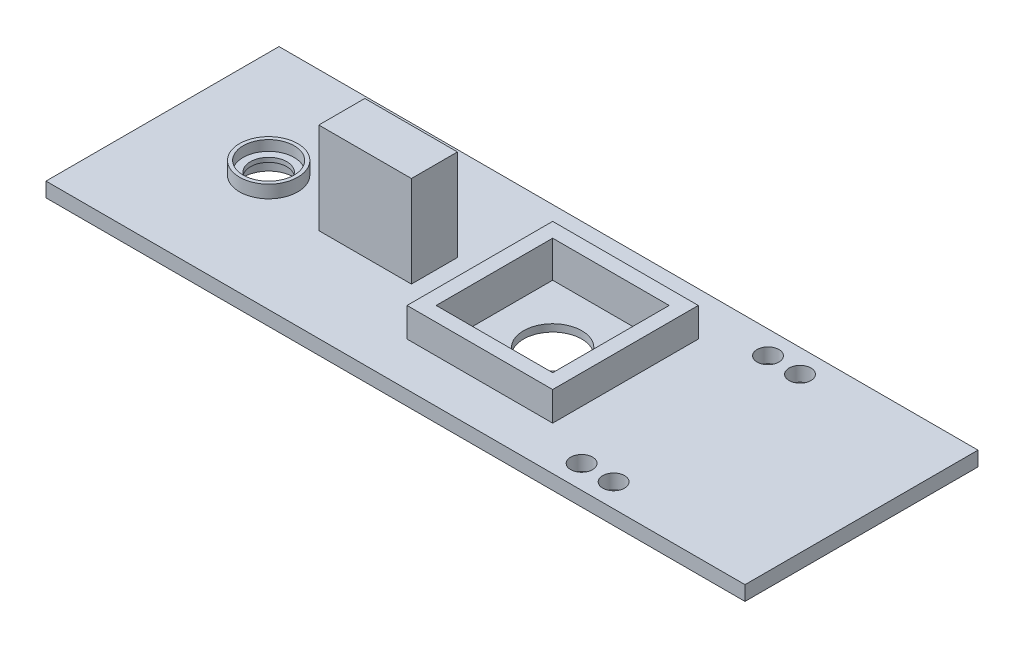
ISO-10303-21;
HEADER;
FILE_DESCRIPTION(('STEP AP214'),'2;1');
FILE_NAME('part.step','',(''),(''),'','','');
FILE_SCHEMA(('AUTOMOTIVE_DESIGN { 1 0 10303 214 1 1 1 1 }'));
ENDSEC;
DATA;
#1=APPLICATION_CONTEXT('core data for automotive mechanical design processes');
#2=APPLICATION_PROTOCOL_DEFINITION('international standard','automotive_design',2000,#1);
#3=PRODUCT_CONTEXT('',#1,'mechanical');
#4=PRODUCT('Part','Part','',(#3));
#5=PRODUCT_RELATED_PRODUCT_CATEGORY('part','',(#4));
#6=PRODUCT_DEFINITION_FORMATION('','',#4);
#7=PRODUCT_DEFINITION_CONTEXT('part definition',#1,'design');
#8=PRODUCT_DEFINITION('design','',#6,#7);
#9=PRODUCT_DEFINITION_SHAPE('','',#8);
#10=(LENGTH_UNIT() NAMED_UNIT(*) SI_UNIT(.MILLI.,.METRE.));
#11=(NAMED_UNIT(*) PLANE_ANGLE_UNIT() SI_UNIT($,.RADIAN.));
#12=(NAMED_UNIT(*) SI_UNIT($,.STERADIAN.) SOLID_ANGLE_UNIT());
#13=UNCERTAINTY_MEASURE_WITH_UNIT(LENGTH_MEASURE(1.E-05),#10,'distance_accuracy_value','');
#14=(GEOMETRIC_REPRESENTATION_CONTEXT(3) GLOBAL_UNCERTAINTY_ASSIGNED_CONTEXT((#13)) GLOBAL_UNIT_ASSIGNED_CONTEXT((#10,
#11,#12)) REPRESENTATION_CONTEXT('',''));
#15=CARTESIAN_POINT('',(0.,0.,0.));
#16=DIRECTION('',(0.,0.,1.));
#17=DIRECTION('',(1.,0.,0.));
#18=AXIS2_PLACEMENT_3D('',#15,#16,#17);
#19=CARTESIAN_POINT('',(-134.66620377136,0.,0.));
#20=DIRECTION('',(0.,1.,0.));
#21=DIRECTION('',(0.,0.,1.));
#22=AXIS2_PLACEMENT_3D('',#19,#20,#21);
#23=CYLINDRICAL_SURFACE('',#22,12.7);
#24=CARTESIAN_POINT('',(-134.66620377136,0.,0.));
#25=DIRECTION('',(0.,1.,0.));
#26=DIRECTION('',(0.,0.,1.));
#27=AXIS2_PLACEMENT_3D('',#24,#25,#26);
#28=CIRCLE('',#27,12.7);
#29=CARTESIAN_POINT('',(-134.66620377136,0.,12.7));
#30=VERTEX_POINT('',#29);
#31=EDGE_CURVE('E260',#30,#30,#28,.T.);
#32=ORIENTED_EDGE('',*,*,#31,.F.);
#33=EDGE_LOOP('',(#32));
#34=FACE_BOUND('',#33,.T.);
#35=CARTESIAN_POINT('',(-134.66620377136,3.175,0.));
#36=DIRECTION('',(0.,1.,0.));
#37=DIRECTION('',(0.,0.,1.));
#38=AXIS2_PLACEMENT_3D('',#35,#36,#37);
#39=CIRCLE('',#38,12.7);
#40=CARTESIAN_POINT('',(-134.66620377136,3.175,12.7));
#41=VERTEX_POINT('',#40);
#42=EDGE_CURVE('E43',#41,#41,#39,.F.);
#43=ORIENTED_EDGE('',*,*,#42,.F.);
#44=EDGE_LOOP('',(#43));
#45=FACE_BOUND('',#44,.T.);
#46=ADVANCED_FACE('F39',(#34,#45),#23,.F.);
#47=CARTESIAN_POINT('',(0.,6.35,0.));
#48=DIRECTION('',(0.,-1.,0.));
#49=DIRECTION('',(0.,0.,-1.));
#50=AXIS2_PLACEMENT_3D('',#47,#48,#49);
#51=PLANE('',#50);
#52=CARTESIAN_POINT('',(-81.4119589800342,6.35,40.64));
#53=DIRECTION('',(0.,1.,0.));
#54=DIRECTION('',(0.,0.,1.));
#55=AXIS2_PLACEMENT_3D('',#52,#53,#54);
#56=CIRCLE('',#55,4.7625);
#57=CARTESIAN_POINT('',(-81.4119589800342,6.35,45.4025));
#58=VERTEX_POINT('',#57);
#59=EDGE_CURVE('E680',#58,#58,#56,.T.);
#60=ORIENTED_EDGE('',*,*,#59,.F.);
#61=EDGE_LOOP('',(#60));
#62=FACE_BOUND('',#61,.T.);
#63=CARTESIAN_POINT('',(-67.4419589800342,6.35,-40.64));
#64=DIRECTION('',(0.,1.,0.));
#65=DIRECTION('',(0.,0.,1.));
#66=AXIS2_PLACEMENT_3D('',#63,#64,#65);
#67=CIRCLE('',#66,4.7625);
#68=CARTESIAN_POINT('',(-67.4419589800342,6.35,-35.8775));
#69=VERTEX_POINT('',#68);
#70=EDGE_CURVE('E685',#69,#69,#67,.T.);
#71=ORIENTED_EDGE('',*,*,#70,.F.);
#72=EDGE_LOOP('',(#71));
#73=FACE_BOUND('',#72,.T.);
#74=CARTESIAN_POINT('',(-81.4119589800342,6.35,-40.64));
#75=DIRECTION('',(0.,1.,0.));
#76=DIRECTION('',(0.,0.,1.));
#77=AXIS2_PLACEMENT_3D('',#74,#75,#76);
#78=CIRCLE('',#77,4.7625);
#79=CARTESIAN_POINT('',(-81.4119589800342,6.35,-35.8775));
#80=VERTEX_POINT('',#79);
#81=EDGE_CURVE('E702',#80,#80,#78,.T.);
#82=ORIENTED_EDGE('',*,*,#81,.F.);
#83=EDGE_LOOP('',(#82));
#84=FACE_BOUND('',#83,.T.);
#85=CARTESIAN_POINT('',(-67.4419589800342,6.35,40.64));
#86=DIRECTION('',(0.,1.,0.));
#87=DIRECTION('',(0.,0.,1.));
#88=AXIS2_PLACEMENT_3D('',#85,#86,#87);
#89=CIRCLE('',#88,4.7625);
#90=CARTESIAN_POINT('',(-67.4419589800342,6.35,45.4025));
#91=VERTEX_POINT('',#90);
#92=EDGE_CURVE('E181',#91,#91,#89,.T.);
#93=ORIENTED_EDGE('',*,*,#92,.F.);
#94=EDGE_LOOP('',(#93));
#95=FACE_BOUND('',#94,.T.);
#96=DIRECTION('',(0.,0.,-1.));
#97=VECTOR('',#96,1.);
#98=CARTESIAN_POINT('',(-226.61201316896,6.35,10.033));
#99=LINE('',#98,#97);
#100=CARTESIAN_POINT('',(-226.61201316896,6.35,10.033));
#101=VERTEX_POINT('',#100);
#102=CARTESIAN_POINT('',(-226.61201316896,6.35,-10.033));
#103=VERTEX_POINT('',#102);
#104=EDGE_CURVE('E56',#101,#103,#99,.T.);
#105=ORIENTED_EDGE('',*,*,#104,.T.);
#106=DIRECTION('',(1.,0.,0.));
#107=VECTOR('',#106,1.);
#108=CARTESIAN_POINT('',(-226.61201316896,6.35,-10.033));
#109=LINE('',#108,#107);
#110=CARTESIAN_POINT('',(-186.22601316896,6.35,-10.033));
#111=VERTEX_POINT('',#110);
#112=EDGE_CURVE('E186',#103,#111,#109,.T.);
#113=ORIENTED_EDGE('',*,*,#112,.T.);
#114=DIRECTION('',(0.,0.,-1.));
#115=VECTOR('',#114,1.);
#116=CARTESIAN_POINT('',(-186.22601316896,6.35,10.033));
#117=LINE('',#116,#115);
#118=CARTESIAN_POINT('',(-186.22601316896,6.35,10.033));
#119=VERTEX_POINT('',#118);
#120=EDGE_CURVE('E170',#119,#111,#117,.T.);
#121=ORIENTED_EDGE('',*,*,#120,.F.);
#122=DIRECTION('',(1.,0.,0.));
#123=VECTOR('',#122,1.);
#124=CARTESIAN_POINT('',(-226.61201316896,6.35,10.033));
#125=LINE('',#124,#123);
#126=EDGE_CURVE('E61',#101,#119,#125,.T.);
#127=ORIENTED_EDGE('',*,*,#126,.F.);
#128=EDGE_LOOP('',(#105,#113,#121,#127));
#129=FACE_BOUND('',#128,.T.);
#130=DIRECTION('',(0.,0.,-1.));
#131=VECTOR('',#130,1.);
#132=CARTESIAN_POINT('',(0.,6.35,50.8));
#133=LINE('',#132,#131);
#134=CARTESIAN_POINT('',(0.,6.35,50.8));
#135=VERTEX_POINT('',#134);
#136=CARTESIAN_POINT('',(0.,6.35,-50.8));
#137=VERTEX_POINT('',#136);
#138=EDGE_CURVE('E283',#135,#137,#133,.T.);
#139=ORIENTED_EDGE('',*,*,#138,.T.);
#140=DIRECTION('',(-1.,0.,0.));
#141=VECTOR('',#140,1.);
#142=CARTESIAN_POINT('',(-304.8,6.35,-50.8));
#143=LINE('',#142,#141);
#144=CARTESIAN_POINT('',(-304.8,6.35,-50.8));
#145=VERTEX_POINT('',#144);
#146=EDGE_CURVE('E286',#137,#145,#143,.T.);
#147=ORIENTED_EDGE('',*,*,#146,.T.);
#148=DIRECTION('',(0.,0.,1.));
#149=VECTOR('',#148,1.);
#150=CARTESIAN_POINT('',(-304.8,6.35,50.8));
#151=LINE('',#150,#149);
#152=CARTESIAN_POINT('',(-304.8,6.35,50.8));
#153=VERTEX_POINT('',#152);
#154=EDGE_CURVE('E289',#145,#153,#151,.T.);
#155=ORIENTED_EDGE('',*,*,#154,.T.);
#156=DIRECTION('',(1.,0.,0.));
#157=VECTOR('',#156,1.);
#158=CARTESIAN_POINT('',(-304.8,6.35,50.8));
#159=LINE('',#158,#157);
#160=EDGE_CURVE('E291',#153,#135,#159,.T.);
#161=ORIENTED_EDGE('',*,*,#160,.T.);
#162=EDGE_LOOP('',(#139,#147,#155,#161));
#163=FACE_BOUND('',#162,.T.);
#164=CARTESIAN_POINT('',(-258.510557856653,6.35,0.));
#165=DIRECTION('',(0.,-1.,0.));
#166=DIRECTION('',(0.,0.,-1.));
#167=AXIS2_PLACEMENT_3D('',#164,#165,#166);
#168=CIRCLE('',#167,12.7);
#169=CARTESIAN_POINT('',(-258.510557856653,6.35,-12.7));
#170=VERTEX_POINT('',#169);
#171=EDGE_CURVE('E11',#170,#170,#168,.F.);
#172=ORIENTED_EDGE('',*,*,#171,.F.);
#173=EDGE_LOOP('',(#172));
#174=FACE_BOUND('',#173,.T.);
#175=DIRECTION('',(0.,0.,1.));
#176=VECTOR('',#175,1.);
#177=CARTESIAN_POINT('',(-166.41620377136,6.35,31.75));
#178=LINE('',#177,#176);
#179=CARTESIAN_POINT('',(-166.41620377136,6.35,-31.75));
#180=VERTEX_POINT('',#179);
#181=CARTESIAN_POINT('',(-166.41620377136,6.35,31.75));
#182=VERTEX_POINT('',#181);
#183=EDGE_CURVE('E238',#180,#182,#178,.T.);
#184=ORIENTED_EDGE('',*,*,#183,.F.);
#185=DIRECTION('',(-1.,0.,0.));
#186=VECTOR('',#185,1.);
#187=CARTESIAN_POINT('',(-102.91620377136,6.35,-31.75));
#188=LINE('',#187,#186);
#189=CARTESIAN_POINT('',(-102.91620377136,6.35,-31.75));
#190=VERTEX_POINT('',#189);
#191=EDGE_CURVE('E231',#190,#180,#188,.T.);
#192=ORIENTED_EDGE('',*,*,#191,.F.);
#193=DIRECTION('',(0.,0.,-1.));
#194=VECTOR('',#193,1.);
#195=CARTESIAN_POINT('',(-102.91620377136,6.35,31.75));
#196=LINE('',#195,#194);
#197=CARTESIAN_POINT('',(-102.91620377136,6.35,31.75));
#198=VERTEX_POINT('',#197);
#199=EDGE_CURVE('E244',#198,#190,#196,.T.);
#200=ORIENTED_EDGE('',*,*,#199,.F.);
#201=DIRECTION('',(1.,0.,0.));
#202=VECTOR('',#201,1.);
#203=CARTESIAN_POINT('',(-102.91620377136,6.35,31.75));
#204=LINE('',#203,#202);
#205=EDGE_CURVE('E241',#182,#198,#204,.T.);
#206=ORIENTED_EDGE('',*,*,#205,.F.);
#207=EDGE_LOOP('',(#184,#192,#200,#206));
#208=FACE_BOUND('',#207,.T.);
#209=ADVANCED_FACE('F353',(#62,#73,#84,#95,#129,#163,#174,#208),#51,.F.);
#210=CARTESIAN_POINT('',(0.,6.35,50.8));
#211=DIRECTION('',(-1.,0.,0.));
#212=DIRECTION('',(0.,0.,1.));
#213=AXIS2_PLACEMENT_3D('',#210,#211,#212);
#214=PLANE('',#213);
#215=DIRECTION('',(0.,0.,-1.));
#216=VECTOR('',#215,1.);
#217=CARTESIAN_POINT('',(0.,0.,50.8));
#218=LINE('',#217,#216);
#219=CARTESIAN_POINT('',(0.,0.,50.8));
#220=VERTEX_POINT('',#219);
#221=CARTESIAN_POINT('',(0.,0.,-50.8));
#222=VERTEX_POINT('',#221);
#223=EDGE_CURVE('E282',#220,#222,#218,.T.);
#224=ORIENTED_EDGE('',*,*,#223,.T.);
#225=DIRECTION('',(0.,-1.,0.));
#226=VECTOR('',#225,1.);
#227=CARTESIAN_POINT('',(0.,6.35,-50.8));
#228=LINE('',#227,#226);
#229=EDGE_CURVE('E48',#137,#222,#228,.T.);
#230=ORIENTED_EDGE('',*,*,#229,.F.);
#231=ORIENTED_EDGE('',*,*,#138,.F.);
#232=DIRECTION('',(0.,-1.,0.));
#233=VECTOR('',#232,1.);
#234=CARTESIAN_POINT('',(0.,6.35,50.8));
#235=LINE('',#234,#233);
#236=EDGE_CURVE('E293',#135,#220,#235,.T.);
#237=ORIENTED_EDGE('',*,*,#236,.T.);
#238=EDGE_LOOP('',(#224,#230,#231,#237));
#239=FACE_BOUND('',#238,.T.);
#240=ADVANCED_FACE('F41',(#239),#214,.F.);
#241=CARTESIAN_POINT('',(-304.8,6.35,-50.8));
#242=DIRECTION('',(0.,0.,1.));
#243=DIRECTION('',(1.,0.,0.));
#244=AXIS2_PLACEMENT_3D('',#241,#242,#243);
#245=PLANE('',#244);
#246=DIRECTION('',(-1.,0.,0.));
#247=VECTOR('',#246,1.);
#248=CARTESIAN_POINT('',(-304.8,0.,-50.8));
#249=LINE('',#248,#247);
#250=CARTESIAN_POINT('',(-304.8,0.,-50.8));
#251=VERTEX_POINT('',#250);
#252=EDGE_CURVE('E296',#222,#251,#249,.T.);
#253=ORIENTED_EDGE('',*,*,#252,.T.);
#254=DIRECTION('',(0.,-1.,0.));
#255=VECTOR('',#254,1.);
#256=CARTESIAN_POINT('',(-304.8,6.35,-50.8));
#257=LINE('',#256,#255);
#258=EDGE_CURVE('E306',#145,#251,#257,.T.);
#259=ORIENTED_EDGE('',*,*,#258,.F.);
#260=ORIENTED_EDGE('',*,*,#146,.F.);
#261=ORIENTED_EDGE('',*,*,#229,.T.);
#262=EDGE_LOOP('',(#253,#259,#260,#261));
#263=FACE_BOUND('',#262,.T.);
#264=ADVANCED_FACE('F351',(#263),#245,.F.);
#265=CARTESIAN_POINT('',(-304.8,6.35,50.8));
#266=DIRECTION('',(1.,0.,0.));
#267=DIRECTION('',(0.,0.,-1.));
#268=AXIS2_PLACEMENT_3D('',#265,#266,#267);
#269=PLANE('',#268);
#270=DIRECTION('',(0.,0.,1.));
#271=VECTOR('',#270,1.);
#272=CARTESIAN_POINT('',(-304.8,0.,50.8));
#273=LINE('',#272,#271);
#274=CARTESIAN_POINT('',(-304.8,0.,50.8));
#275=VERTEX_POINT('',#274);
#276=EDGE_CURVE('E298',#251,#275,#273,.T.);
#277=ORIENTED_EDGE('',*,*,#276,.T.);
#278=DIRECTION('',(0.,-1.,0.));
#279=VECTOR('',#278,1.);
#280=CARTESIAN_POINT('',(-304.8,6.35,50.8));
#281=LINE('',#280,#279);
#282=EDGE_CURVE('E303',#153,#275,#281,.T.);
#283=ORIENTED_EDGE('',*,*,#282,.F.);
#284=ORIENTED_EDGE('',*,*,#154,.F.);
#285=ORIENTED_EDGE('',*,*,#258,.T.);
#286=EDGE_LOOP('',(#277,#283,#284,#285));
#287=FACE_BOUND('',#286,.T.);
#288=ADVANCED_FACE('F348',(#287),#269,.F.);
#289=CARTESIAN_POINT('',(-304.8,6.35,50.8));
#290=DIRECTION('',(0.,0.,-1.));
#291=DIRECTION('',(-1.,0.,0.));
#292=AXIS2_PLACEMENT_3D('',#289,#290,#291);
#293=PLANE('',#292);
#294=DIRECTION('',(1.,0.,0.));
#295=VECTOR('',#294,1.);
#296=CARTESIAN_POINT('',(-304.8,0.,50.8));
#297=LINE('',#296,#295);
#298=EDGE_CURVE('E287',#275,#220,#297,.T.);
#299=ORIENTED_EDGE('',*,*,#298,.T.);
#300=ORIENTED_EDGE('',*,*,#236,.F.);
#301=ORIENTED_EDGE('',*,*,#160,.F.);
#302=ORIENTED_EDGE('',*,*,#282,.T.);
#303=EDGE_LOOP('',(#299,#300,#301,#302));
#304=FACE_BOUND('',#303,.T.);
#305=ADVANCED_FACE('F333',(#304),#293,.F.);
#306=CARTESIAN_POINT('',(0.,0.,0.));
#307=DIRECTION('',(0.,-1.,0.));
#308=DIRECTION('',(0.,0.,-1.));
#309=AXIS2_PLACEMENT_3D('',#306,#307,#308);
#310=PLANE('',#309);
#311=CARTESIAN_POINT('',(-81.4119589800342,0.,40.64));
#312=DIRECTION('',(0.,1.,0.));
#313=DIRECTION('',(0.,0.,1.));
#314=AXIS2_PLACEMENT_3D('',#311,#312,#313);
#315=CIRCLE('',#314,4.7625);
#316=CARTESIAN_POINT('',(-81.4119589800342,0.,45.4025));
#317=VERTEX_POINT('',#316);
#318=EDGE_CURVE('E677',#317,#317,#315,.T.);
#319=ORIENTED_EDGE('',*,*,#318,.T.);
#320=EDGE_LOOP('',(#319));
#321=FACE_BOUND('',#320,.T.);
#322=CARTESIAN_POINT('',(-67.4419589800342,0.,-40.64));
#323=DIRECTION('',(0.,1.,0.));
#324=DIRECTION('',(0.,0.,1.));
#325=AXIS2_PLACEMENT_3D('',#322,#323,#324);
#326=CIRCLE('',#325,4.7625);
#327=CARTESIAN_POINT('',(-67.4419589800342,0.,-35.8775));
#328=VERTEX_POINT('',#327);
#329=EDGE_CURVE('E681',#328,#328,#326,.T.);
#330=ORIENTED_EDGE('',*,*,#329,.T.);
#331=EDGE_LOOP('',(#330));
#332=FACE_BOUND('',#331,.T.);
#333=CARTESIAN_POINT('',(-81.4119589800342,0.,-40.64));
#334=DIRECTION('',(0.,1.,0.));
#335=DIRECTION('',(0.,0.,1.));
#336=AXIS2_PLACEMENT_3D('',#333,#334,#335);
#337=CIRCLE('',#336,4.7625);
#338=CARTESIAN_POINT('',(-81.4119589800342,0.,-35.8775));
#339=VERTEX_POINT('',#338);
#340=EDGE_CURVE('E690',#339,#339,#337,.T.);
#341=ORIENTED_EDGE('',*,*,#340,.T.);
#342=EDGE_LOOP('',(#341));
#343=FACE_BOUND('',#342,.T.);
#344=CARTESIAN_POINT('',(-67.4419589800342,0.,40.64));
#345=DIRECTION('',(0.,1.,0.));
#346=DIRECTION('',(0.,0.,1.));
#347=AXIS2_PLACEMENT_3D('',#344,#345,#346);
#348=CIRCLE('',#347,4.7625);
#349=CARTESIAN_POINT('',(-67.4419589800342,0.,45.4025));
#350=VERTEX_POINT('',#349);
#351=EDGE_CURVE('E188',#350,#350,#348,.T.);
#352=ORIENTED_EDGE('',*,*,#351,.T.);
#353=EDGE_LOOP('',(#352));
#354=FACE_BOUND('',#353,.T.);
#355=ORIENTED_EDGE('',*,*,#31,.T.);
#356=EDGE_LOOP('',(#355));
#357=FACE_BOUND('',#356,.T.);
#358=CARTESIAN_POINT('',(-258.510557856653,0.,0.));
#359=DIRECTION('',(0.,-1.,0.));
#360=DIRECTION('',(0.,0.,-1.));
#361=AXIS2_PLACEMENT_3D('',#358,#359,#360);
#362=CIRCLE('',#361,11.1125);
#363=CARTESIAN_POINT('',(-258.510557856653,0.,-11.1125));
#364=VERTEX_POINT('',#363);
#365=EDGE_CURVE('E271',#364,#364,#362,.T.);
#366=ORIENTED_EDGE('',*,*,#365,.F.);
#367=EDGE_LOOP('',(#366));
#368=FACE_BOUND('',#367,.T.);
#369=ORIENTED_EDGE('',*,*,#223,.F.);
#370=ORIENTED_EDGE('',*,*,#298,.F.);
#371=ORIENTED_EDGE('',*,*,#276,.F.);
#372=ORIENTED_EDGE('',*,*,#252,.F.);
#373=EDGE_LOOP('',(#369,#370,#371,#372));
#374=FACE_BOUND('',#373,.T.);
#375=ADVANCED_FACE('F329',(#321,#332,#343,#354,#357,#368,#374),#310,.T.);
#376=CARTESIAN_POINT('',(-258.510557856653,11.90625,0.));
#377=DIRECTION('',(0.,-1.,0.));
#378=DIRECTION('',(0.,0.,-1.));
#379=AXIS2_PLACEMENT_3D('',#376,#377,#378);
#380=CYLINDRICAL_SURFACE('',#379,12.7);
#381=CARTESIAN_POINT('',(-258.510557856653,11.90625,0.));
#382=DIRECTION('',(0.,1.,0.));
#383=DIRECTION('',(0.,0.,1.));
#384=AXIS2_PLACEMENT_3D('',#381,#382,#383);
#385=CIRCLE('',#384,12.7);
#386=CARTESIAN_POINT('',(-258.510557856653,11.90625,12.7));
#387=VERTEX_POINT('',#386);
#388=EDGE_CURVE('E277',#387,#387,#385,.T.);
#389=ORIENTED_EDGE('',*,*,#388,.F.);
#390=EDGE_LOOP('',(#389));
#391=FACE_BOUND('',#390,.T.);
#392=ORIENTED_EDGE('',*,*,#171,.T.);
#393=EDGE_LOOP('',(#392));
#394=FACE_BOUND('',#393,.T.);
#395=ADVANCED_FACE('F332',(#391,#394),#380,.T.);
#396=CARTESIAN_POINT('',(-258.510557856653,11.90625,0.));
#397=DIRECTION('',(0.,1.,0.));
#398=DIRECTION('',(0.,0.,1.));
#399=AXIS2_PLACEMENT_3D('',#396,#397,#398);
#400=PLANE('',#399);
#401=CARTESIAN_POINT('',(-258.510557856653,11.90625,0.));
#402=DIRECTION('',(0.,1.,0.));
#403=DIRECTION('',(0.,0.,1.));
#404=AXIS2_PLACEMENT_3D('',#401,#402,#403);
#405=CIRCLE('',#404,11.1125);
#406=CARTESIAN_POINT('',(-258.510557856653,11.90625,11.1125));
#407=VERTEX_POINT('',#406);
#408=EDGE_CURVE('E270',#407,#407,#405,.T.);
#409=ORIENTED_EDGE('',*,*,#408,.F.);
#410=EDGE_LOOP('',(#409));
#411=FACE_BOUND('',#410,.T.);
#412=ORIENTED_EDGE('',*,*,#388,.T.);
#413=EDGE_LOOP('',(#412));
#414=FACE_BOUND('',#413,.T.);
#415=ADVANCED_FACE('F401',(#411,#414),#400,.T.);
#416=CARTESIAN_POINT('',(-258.510557856653,7.46125,0.));
#417=DIRECTION('',(0.,1.,0.));
#418=DIRECTION('',(0.,0.,1.));
#419=AXIS2_PLACEMENT_3D('',#416,#417,#418);
#420=CYLINDRICAL_SURFACE('',#419,11.1125);
#421=CARTESIAN_POINT('',(-258.510557856653,7.46125,0.));
#422=DIRECTION('',(0.,1.,0.));
#423=DIRECTION('',(0.,0.,1.));
#424=AXIS2_PLACEMENT_3D('',#421,#422,#423);
#425=CIRCLE('',#424,11.1125);
#426=CARTESIAN_POINT('',(-258.510557856653,7.46125,11.1125));
#427=VERTEX_POINT('',#426);
#428=EDGE_CURVE('E274',#427,#427,#425,.T.);
#429=ORIENTED_EDGE('',*,*,#428,.F.);
#430=EDGE_LOOP('',(#429));
#431=FACE_BOUND('',#430,.T.);
#432=ORIENTED_EDGE('',*,*,#408,.T.);
#433=EDGE_LOOP('',(#432));
#434=FACE_BOUND('',#433,.T.);
#435=ADVANCED_FACE('F397',(#431,#434),#420,.F.);
#436=CARTESIAN_POINT('',(-258.510557856653,7.46125,0.));
#437=DIRECTION('',(0.,1.,0.));
#438=DIRECTION('',(0.,0.,1.));
#439=AXIS2_PLACEMENT_3D('',#436,#437,#438);
#440=PLANE('',#439);
#441=CARTESIAN_POINT('',(-258.510557856653,7.46125,0.));
#442=DIRECTION('',(0.,1.,0.));
#443=DIRECTION('',(0.,0.,1.));
#444=AXIS2_PLACEMENT_3D('',#441,#442,#443);
#445=CIRCLE('',#444,7.93749999999998);
#446=CARTESIAN_POINT('',(-258.510557856653,7.46125,7.93749999999998));
#447=VERTEX_POINT('',#446);
#448=EDGE_CURVE('E263',#447,#447,#445,.T.);
#449=ORIENTED_EDGE('',*,*,#448,.F.);
#450=EDGE_LOOP('',(#449));
#451=FACE_BOUND('',#450,.T.);
#452=ORIENTED_EDGE('',*,*,#428,.T.);
#453=EDGE_LOOP('',(#452));
#454=FACE_BOUND('',#453,.T.);
#455=ADVANCED_FACE('F325',(#451,#454),#440,.T.);
#456=CARTESIAN_POINT('',(-258.510557856653,5.55625,0.));
#457=DIRECTION('',(0.,-1.,0.));
#458=DIRECTION('',(0.,0.,-1.));
#459=AXIS2_PLACEMENT_3D('',#456,#457,#458);
#460=CYLINDRICAL_SURFACE('',#459,11.1125);
#461=CARTESIAN_POINT('',(-258.510557856653,5.55625,0.));
#462=DIRECTION('',(0.,-1.,0.));
#463=DIRECTION('',(0.,0.,-1.));
#464=AXIS2_PLACEMENT_3D('',#461,#462,#463);
#465=CIRCLE('',#464,11.1125);
#466=CARTESIAN_POINT('',(-258.510557856653,5.55625,-11.1125));
#467=VERTEX_POINT('',#466);
#468=EDGE_CURVE('E267',#467,#467,#465,.T.);
#469=ORIENTED_EDGE('',*,*,#468,.F.);
#470=EDGE_LOOP('',(#469));
#471=FACE_BOUND('',#470,.T.);
#472=ORIENTED_EDGE('',*,*,#365,.T.);
#473=EDGE_LOOP('',(#472));
#474=FACE_BOUND('',#473,.T.);
#475=ADVANCED_FACE('F319',(#471,#474),#460,.F.);
#476=CARTESIAN_POINT('',(-258.510557856653,5.55625,0.));
#477=DIRECTION('',(0.,-1.,0.));
#478=DIRECTION('',(0.,0.,-1.));
#479=AXIS2_PLACEMENT_3D('',#476,#477,#478);
#480=PLANE('',#479);
#481=CARTESIAN_POINT('',(-258.510557856653,5.55625,0.));
#482=DIRECTION('',(0.,-1.,0.));
#483=DIRECTION('',(0.,0.,-1.));
#484=AXIS2_PLACEMENT_3D('',#481,#482,#483);
#485=CIRCLE('',#484,7.93749999999998);
#486=CARTESIAN_POINT('',(-258.510557856653,5.55625,-7.93749999999998));
#487=VERTEX_POINT('',#486);
#488=EDGE_CURVE('E266',#487,#487,#485,.T.);
#489=ORIENTED_EDGE('',*,*,#488,.F.);
#490=EDGE_LOOP('',(#489));
#491=FACE_BOUND('',#490,.T.);
#492=ORIENTED_EDGE('',*,*,#468,.T.);
#493=EDGE_LOOP('',(#492));
#494=FACE_BOUND('',#493,.T.);
#495=ADVANCED_FACE('F316',(#491,#494),#480,.T.);
#496=CARTESIAN_POINT('',(-258.510557856653,0.,0.));
#497=DIRECTION('',(0.,1.,0.));
#498=DIRECTION('',(0.,0.,1.));
#499=AXIS2_PLACEMENT_3D('',#496,#497,#498);
#500=CYLINDRICAL_SURFACE('',#499,7.93749999999998);
#501=ORIENTED_EDGE('',*,*,#488,.T.);
#502=EDGE_LOOP('',(#501));
#503=FACE_BOUND('',#502,.T.);
#504=ORIENTED_EDGE('',*,*,#448,.T.);
#505=EDGE_LOOP('',(#504));
#506=FACE_BOUND('',#505,.T.);
#507=ADVANCED_FACE('F313',(#503,#506),#500,.F.);
#508=CARTESIAN_POINT('',(-166.41620377136,19.05,31.75));
#509=DIRECTION('',(1.,0.,0.));
#510=DIRECTION('',(0.,0.,-1.));
#511=AXIS2_PLACEMENT_3D('',#508,#509,#510);
#512=PLANE('',#511);
#513=ORIENTED_EDGE('',*,*,#183,.T.);
#514=DIRECTION('',(0.,-1.,0.));
#515=VECTOR('',#514,1.);
#516=CARTESIAN_POINT('',(-166.41620377136,19.05,31.75));
#517=LINE('',#516,#515);
#518=CARTESIAN_POINT('',(-166.41620377136,19.05,31.75));
#519=VERTEX_POINT('',#518);
#520=EDGE_CURVE('E257',#519,#182,#517,.T.);
#521=ORIENTED_EDGE('',*,*,#520,.F.);
#522=DIRECTION('',(0.,0.,1.));
#523=VECTOR('',#522,1.);
#524=CARTESIAN_POINT('',(-166.41620377136,19.05,31.75));
#525=LINE('',#524,#523);
#526=CARTESIAN_POINT('',(-166.41620377136,19.05,-31.75));
#527=VERTEX_POINT('',#526);
#528=EDGE_CURVE('E227',#527,#519,#525,.T.);
#529=ORIENTED_EDGE('',*,*,#528,.F.);
#530=DIRECTION('',(0.,-1.,0.));
#531=VECTOR('',#530,1.);
#532=CARTESIAN_POINT('',(-166.41620377136,19.05,-31.75));
#533=LINE('',#532,#531);
#534=EDGE_CURVE('E237',#527,#180,#533,.T.);
#535=ORIENTED_EDGE('',*,*,#534,.T.);
#536=EDGE_LOOP('',(#513,#521,#529,#535));
#537=FACE_BOUND('',#536,.T.);
#538=ADVANCED_FACE('F368',(#537),#512,.F.);
#539=CARTESIAN_POINT('',(-102.91620377136,19.05,31.75));
#540=DIRECTION('',(0.,0.,-1.));
#541=DIRECTION('',(-1.,0.,0.));
#542=AXIS2_PLACEMENT_3D('',#539,#540,#541);
#543=PLANE('',#542);
#544=ORIENTED_EDGE('',*,*,#205,.T.);
#545=DIRECTION('',(0.,-1.,0.));
#546=VECTOR('',#545,1.);
#547=CARTESIAN_POINT('',(-102.91620377136,19.05,31.75));
#548=LINE('',#547,#546);
#549=CARTESIAN_POINT('',(-102.91620377136,19.05,31.75));
#550=VERTEX_POINT('',#549);
#551=EDGE_CURVE('E254',#550,#198,#548,.T.);
#552=ORIENTED_EDGE('',*,*,#551,.F.);
#553=DIRECTION('',(1.,0.,0.));
#554=VECTOR('',#553,1.);
#555=CARTESIAN_POINT('',(-102.91620377136,19.05,31.75));
#556=LINE('',#555,#554);
#557=EDGE_CURVE('E230',#519,#550,#556,.T.);
#558=ORIENTED_EDGE('',*,*,#557,.F.);
#559=ORIENTED_EDGE('',*,*,#520,.T.);
#560=EDGE_LOOP('',(#544,#552,#558,#559));
#561=FACE_BOUND('',#560,.T.);
#562=ADVANCED_FACE('F376',(#561),#543,.F.);
#563=CARTESIAN_POINT('',(-102.91620377136,19.05,31.75));
#564=DIRECTION('',(-1.,0.,0.));
#565=DIRECTION('',(0.,0.,1.));
#566=AXIS2_PLACEMENT_3D('',#563,#564,#565);
#567=PLANE('',#566);
#568=ORIENTED_EDGE('',*,*,#199,.T.);
#569=DIRECTION('',(0.,-1.,0.));
#570=VECTOR('',#569,1.);
#571=CARTESIAN_POINT('',(-102.91620377136,19.05,-31.75));
#572=LINE('',#571,#570);
#573=CARTESIAN_POINT('',(-102.91620377136,19.05,-31.75));
#574=VERTEX_POINT('',#573);
#575=EDGE_CURVE('E251',#574,#190,#572,.T.);
#576=ORIENTED_EDGE('',*,*,#575,.F.);
#577=DIRECTION('',(0.,0.,-1.));
#578=VECTOR('',#577,1.);
#579=CARTESIAN_POINT('',(-102.91620377136,19.05,31.75));
#580=LINE('',#579,#578);
#581=EDGE_CURVE('E233',#550,#574,#580,.T.);
#582=ORIENTED_EDGE('',*,*,#581,.F.);
#583=ORIENTED_EDGE('',*,*,#551,.T.);
#584=EDGE_LOOP('',(#568,#576,#582,#583));
#585=FACE_BOUND('',#584,.T.);
#586=ADVANCED_FACE('F374',(#585),#567,.F.);
#587=CARTESIAN_POINT('',(-102.91620377136,19.05,-31.75));
#588=DIRECTION('',(0.,0.,1.));
#589=DIRECTION('',(1.,0.,0.));
#590=AXIS2_PLACEMENT_3D('',#587,#588,#589);
#591=PLANE('',#590);
#592=ORIENTED_EDGE('',*,*,#191,.T.);
#593=ORIENTED_EDGE('',*,*,#534,.F.);
#594=DIRECTION('',(-1.,0.,0.));
#595=VECTOR('',#594,1.);
#596=CARTESIAN_POINT('',(-102.91620377136,19.05,-31.75));
#597=LINE('',#596,#595);
#598=EDGE_CURVE('E235',#574,#527,#597,.T.);
#599=ORIENTED_EDGE('',*,*,#598,.F.);
#600=ORIENTED_EDGE('',*,*,#575,.T.);
#601=EDGE_LOOP('',(#592,#593,#599,#600));
#602=FACE_BOUND('',#601,.T.);
#603=ADVANCED_FACE('F364',(#602),#591,.F.);
#604=CARTESIAN_POINT('',(0.,19.05,0.));
#605=DIRECTION('',(0.,1.,0.));
#606=DIRECTION('',(0.,0.,1.));
#607=AXIS2_PLACEMENT_3D('',#604,#605,#606);
#608=PLANE('',#607);
#609=DIRECTION('',(0.,0.,1.));
#610=VECTOR('',#609,1.);
#611=CARTESIAN_POINT('',(-160.06620377136,19.05,25.4));
#612=LINE('',#611,#610);
#613=CARTESIAN_POINT('',(-160.06620377136,19.05,-25.4));
#614=VERTEX_POINT('',#613);
#615=CARTESIAN_POINT('',(-160.06620377136,19.05,25.4));
#616=VERTEX_POINT('',#615);
#617=EDGE_CURVE('E192',#614,#616,#612,.T.);
#618=ORIENTED_EDGE('',*,*,#617,.F.);
#619=DIRECTION('',(-1.,0.,0.));
#620=VECTOR('',#619,1.);
#621=CARTESIAN_POINT('',(-109.26620377136,19.05,-25.4));
#622=LINE('',#621,#620);
#623=CARTESIAN_POINT('',(-109.26620377136,19.05,-25.4));
#624=VERTEX_POINT('',#623);
#625=EDGE_CURVE('E200',#624,#614,#622,.T.);
#626=ORIENTED_EDGE('',*,*,#625,.F.);
#627=DIRECTION('',(0.,0.,-1.));
#628=VECTOR('',#627,1.);
#629=CARTESIAN_POINT('',(-109.26620377136,19.05,25.4));
#630=LINE('',#629,#628);
#631=CARTESIAN_POINT('',(-109.26620377136,19.05,25.4));
#632=VERTEX_POINT('',#631);
#633=EDGE_CURVE('E214',#632,#624,#630,.T.);
#634=ORIENTED_EDGE('',*,*,#633,.F.);
#635=DIRECTION('',(1.,0.,0.));
#636=VECTOR('',#635,1.);
#637=CARTESIAN_POINT('',(-109.26620377136,19.05,25.4));
#638=LINE('',#637,#636);
#639=EDGE_CURVE('E211',#616,#632,#638,.T.);
#640=ORIENTED_EDGE('',*,*,#639,.F.);
#641=EDGE_LOOP('',(#618,#626,#634,#640));
#642=FACE_BOUND('',#641,.T.);
#643=ORIENTED_EDGE('',*,*,#528,.T.);
#644=ORIENTED_EDGE('',*,*,#557,.T.);
#645=ORIENTED_EDGE('',*,*,#581,.T.);
#646=ORIENTED_EDGE('',*,*,#598,.T.);
#647=EDGE_LOOP('',(#643,#644,#645,#646));
#648=FACE_BOUND('',#647,.T.);
#649=ADVANCED_FACE('F370',(#642,#648),#608,.T.);
#650=CARTESIAN_POINT('',(0.,3.175,0.));
#651=DIRECTION('',(0.,1.,0.));
#652=DIRECTION('',(0.,0.,1.));
#653=AXIS2_PLACEMENT_3D('',#650,#651,#652);
#654=PLANE('',#653);
#655=DIRECTION('',(0.,0.,1.));
#656=VECTOR('',#655,1.);
#657=CARTESIAN_POINT('',(-160.06620377136,3.175,25.4));
#658=LINE('',#657,#656);
#659=CARTESIAN_POINT('',(-160.06620377136,3.175,-25.4));
#660=VERTEX_POINT('',#659);
#661=CARTESIAN_POINT('',(-160.06620377136,3.175,25.4));
#662=VERTEX_POINT('',#661);
#663=EDGE_CURVE('E196',#660,#662,#658,.T.);
#664=ORIENTED_EDGE('',*,*,#663,.T.);
#665=DIRECTION('',(1.,0.,0.));
#666=VECTOR('',#665,1.);
#667=CARTESIAN_POINT('',(-109.26620377136,3.175,25.4));
#668=LINE('',#667,#666);
#669=CARTESIAN_POINT('',(-109.26620377136,3.175,25.4));
#670=VERTEX_POINT('',#669);
#671=EDGE_CURVE('E199',#662,#670,#668,.T.);
#672=ORIENTED_EDGE('',*,*,#671,.T.);
#673=DIRECTION('',(0.,0.,-1.));
#674=VECTOR('',#673,1.);
#675=CARTESIAN_POINT('',(-109.26620377136,3.175,25.4));
#676=LINE('',#675,#674);
#677=CARTESIAN_POINT('',(-109.26620377136,3.175,-25.4));
#678=VERTEX_POINT('',#677);
#679=EDGE_CURVE('E203',#670,#678,#676,.T.);
#680=ORIENTED_EDGE('',*,*,#679,.T.);
#681=DIRECTION('',(-1.,0.,0.));
#682=VECTOR('',#681,1.);
#683=CARTESIAN_POINT('',(-109.26620377136,3.175,-25.4));
#684=LINE('',#683,#682);
#685=EDGE_CURVE('E206',#678,#660,#684,.T.);
#686=ORIENTED_EDGE('',*,*,#685,.T.);
#687=EDGE_LOOP('',(#664,#672,#680,#686));
#688=FACE_BOUND('',#687,.T.);
#689=ORIENTED_EDGE('',*,*,#42,.T.);
#690=EDGE_LOOP('',(#689));
#691=FACE_BOUND('',#690,.T.);
#692=ADVANCED_FACE('F498',(#688,#691),#654,.T.);
#693=CARTESIAN_POINT('',(-160.06620377136,3.175,25.4));
#694=DIRECTION('',(-1.,0.,0.));
#695=DIRECTION('',(0.,0.,1.));
#696=AXIS2_PLACEMENT_3D('',#693,#694,#695);
#697=PLANE('',#696);
#698=ORIENTED_EDGE('',*,*,#617,.T.);
#699=DIRECTION('',(0.,1.,0.));
#700=VECTOR('',#699,1.);
#701=CARTESIAN_POINT('',(-160.06620377136,3.175,25.4));
#702=LINE('',#701,#700);
#703=EDGE_CURVE('E209',#662,#616,#702,.T.);
#704=ORIENTED_EDGE('',*,*,#703,.F.);
#705=ORIENTED_EDGE('',*,*,#663,.F.);
#706=DIRECTION('',(0.,1.,0.));
#707=VECTOR('',#706,1.);
#708=CARTESIAN_POINT('',(-160.06620377136,3.175,-25.4));
#709=LINE('',#708,#707);
#710=EDGE_CURVE('E219',#660,#614,#709,.T.);
#711=ORIENTED_EDGE('',*,*,#710,.T.);
#712=EDGE_LOOP('',(#698,#704,#705,#711));
#713=FACE_BOUND('',#712,.T.);
#714=ADVANCED_FACE('F501',(#713),#697,.F.);
#715=CARTESIAN_POINT('',(-109.26620377136,3.175,-25.4));
#716=DIRECTION('',(0.,0.,-1.));
#717=DIRECTION('',(-1.,0.,0.));
#718=AXIS2_PLACEMENT_3D('',#715,#716,#717);
#719=PLANE('',#718);
#720=ORIENTED_EDGE('',*,*,#625,.T.);
#721=ORIENTED_EDGE('',*,*,#710,.F.);
#722=ORIENTED_EDGE('',*,*,#685,.F.);
#723=DIRECTION('',(0.,1.,0.));
#724=VECTOR('',#723,1.);
#725=CARTESIAN_POINT('',(-109.26620377136,3.175,-25.4));
#726=LINE('',#725,#724);
#727=EDGE_CURVE('E221',#678,#624,#726,.T.);
#728=ORIENTED_EDGE('',*,*,#727,.T.);
#729=EDGE_LOOP('',(#720,#721,#722,#728));
#730=FACE_BOUND('',#729,.T.);
#731=ADVANCED_FACE('F503',(#730),#719,.F.);
#732=CARTESIAN_POINT('',(-109.26620377136,3.175,25.4));
#733=DIRECTION('',(1.,0.,0.));
#734=DIRECTION('',(0.,0.,-1.));
#735=AXIS2_PLACEMENT_3D('',#732,#733,#734);
#736=PLANE('',#735);
#737=ORIENTED_EDGE('',*,*,#633,.T.);
#738=ORIENTED_EDGE('',*,*,#727,.F.);
#739=ORIENTED_EDGE('',*,*,#679,.F.);
#740=DIRECTION('',(0.,1.,0.));
#741=VECTOR('',#740,1.);
#742=CARTESIAN_POINT('',(-109.26620377136,3.175,25.4));
#743=LINE('',#742,#741);
#744=EDGE_CURVE('E223',#670,#632,#743,.T.);
#745=ORIENTED_EDGE('',*,*,#744,.T.);
#746=EDGE_LOOP('',(#737,#738,#739,#745));
#747=FACE_BOUND('',#746,.T.);
#748=ADVANCED_FACE('F506',(#747),#736,.F.);
#749=CARTESIAN_POINT('',(-109.26620377136,3.175,25.4));
#750=DIRECTION('',(0.,0.,1.));
#751=DIRECTION('',(1.,0.,0.));
#752=AXIS2_PLACEMENT_3D('',#749,#750,#751);
#753=PLANE('',#752);
#754=ORIENTED_EDGE('',*,*,#639,.T.);
#755=ORIENTED_EDGE('',*,*,#744,.F.);
#756=ORIENTED_EDGE('',*,*,#671,.F.);
#757=ORIENTED_EDGE('',*,*,#703,.T.);
#758=EDGE_LOOP('',(#754,#755,#756,#757));
#759=FACE_BOUND('',#758,.T.);
#760=ADVANCED_FACE('F497',(#759),#753,.F.);
#761=CARTESIAN_POINT('',(-226.61201316896,46.228,-10.033));
#762=DIRECTION('',(0.,0.,-1.));
#763=DIRECTION('',(-1.,0.,0.));
#764=AXIS2_PLACEMENT_3D('',#761,#762,#763);
#765=PLANE('',#764);
#766=ORIENTED_EDGE('',*,*,#112,.F.);
#767=DIRECTION('',(0.,-1.,0.));
#768=VECTOR('',#767,1.);
#769=CARTESIAN_POINT('',(-226.61201316896,46.228,-10.033));
#770=LINE('',#769,#768);
#771=CARTESIAN_POINT('',(-226.61201316896,46.228,-10.033));
#772=VERTEX_POINT('',#771);
#773=EDGE_CURVE('E177',#772,#103,#770,.T.);
#774=ORIENTED_EDGE('',*,*,#773,.F.);
#775=DIRECTION('',(1.,0.,0.));
#776=VECTOR('',#775,1.);
#777=CARTESIAN_POINT('',(-226.61201316896,46.228,-10.033));
#778=LINE('',#777,#776);
#779=CARTESIAN_POINT('',(-186.22601316896,46.228,-10.033));
#780=VERTEX_POINT('',#779);
#781=EDGE_CURVE('E158',#772,#780,#778,.T.);
#782=ORIENTED_EDGE('',*,*,#781,.T.);
#783=DIRECTION('',(0.,-1.,0.));
#784=VECTOR('',#783,1.);
#785=CARTESIAN_POINT('',(-186.22601316896,46.228,-10.033));
#786=LINE('',#785,#784);
#787=EDGE_CURVE('E168',#780,#111,#786,.T.);
#788=ORIENTED_EDGE('',*,*,#787,.T.);
#789=EDGE_LOOP('',(#766,#774,#782,#788));
#790=FACE_BOUND('',#789,.T.);
#791=ADVANCED_FACE('F176',(#790),#765,.T.);
#792=CARTESIAN_POINT('',(-226.61201316896,46.228,10.033));
#793=DIRECTION('',(-1.,0.,0.));
#794=DIRECTION('',(0.,0.,1.));
#795=AXIS2_PLACEMENT_3D('',#792,#793,#794);
#796=PLANE('',#795);
#797=ORIENTED_EDGE('',*,*,#104,.F.);
#798=DIRECTION('',(0.,-1.,0.));
#799=VECTOR('',#798,1.);
#800=CARTESIAN_POINT('',(-226.61201316896,46.228,10.033));
#801=LINE('',#800,#799);
#802=CARTESIAN_POINT('',(-226.61201316896,46.228,10.033));
#803=VERTEX_POINT('',#802);
#804=EDGE_CURVE('E193',#803,#101,#801,.T.);
#805=ORIENTED_EDGE('',*,*,#804,.F.);
#806=DIRECTION('',(0.,0.,-1.));
#807=VECTOR('',#806,1.);
#808=CARTESIAN_POINT('',(-226.61201316896,46.228,10.033));
#809=LINE('',#808,#807);
#810=EDGE_CURVE('E174',#803,#772,#809,.T.);
#811=ORIENTED_EDGE('',*,*,#810,.T.);
#812=ORIENTED_EDGE('',*,*,#773,.T.);
#813=EDGE_LOOP('',(#797,#805,#811,#812));
#814=FACE_BOUND('',#813,.T.);
#815=ADVANCED_FACE('F485',(#814),#796,.T.);
#816=CARTESIAN_POINT('',(-226.61201316896,46.228,10.033));
#817=DIRECTION('',(0.,0.,-1.));
#818=DIRECTION('',(-1.,0.,0.));
#819=AXIS2_PLACEMENT_3D('',#816,#817,#818);
#820=PLANE('',#819);
#821=ORIENTED_EDGE('',*,*,#126,.T.);
#822=DIRECTION('',(0.,-1.,0.));
#823=VECTOR('',#822,1.);
#824=CARTESIAN_POINT('',(-186.22601316896,46.228,10.033));
#825=LINE('',#824,#823);
#826=CARTESIAN_POINT('',(-186.22601316896,46.228,10.033));
#827=VERTEX_POINT('',#826);
#828=EDGE_CURVE('E173',#827,#119,#825,.T.);
#829=ORIENTED_EDGE('',*,*,#828,.F.);
#830=DIRECTION('',(1.,0.,0.));
#831=VECTOR('',#830,1.);
#832=CARTESIAN_POINT('',(-226.61201316896,46.228,10.033));
#833=LINE('',#832,#831);
#834=EDGE_CURVE('E161',#803,#827,#833,.T.);
#835=ORIENTED_EDGE('',*,*,#834,.F.);
#836=ORIENTED_EDGE('',*,*,#804,.T.);
#837=EDGE_LOOP('',(#821,#829,#835,#836));
#838=FACE_BOUND('',#837,.T.);
#839=ADVANCED_FACE('F488',(#838),#820,.F.);
#840=CARTESIAN_POINT('',(-186.22601316896,46.228,10.033));
#841=DIRECTION('',(-1.,0.,0.));
#842=DIRECTION('',(0.,0.,1.));
#843=AXIS2_PLACEMENT_3D('',#840,#841,#842);
#844=PLANE('',#843);
#845=ORIENTED_EDGE('',*,*,#120,.T.);
#846=ORIENTED_EDGE('',*,*,#787,.F.);
#847=DIRECTION('',(0.,0.,-1.));
#848=VECTOR('',#847,1.);
#849=CARTESIAN_POINT('',(-186.22601316896,46.228,10.033));
#850=LINE('',#849,#848);
#851=EDGE_CURVE('E153',#827,#780,#850,.T.);
#852=ORIENTED_EDGE('',*,*,#851,.F.);
#853=ORIENTED_EDGE('',*,*,#828,.T.);
#854=EDGE_LOOP('',(#845,#846,#852,#853));
#855=FACE_BOUND('',#854,.T.);
#856=ADVANCED_FACE('F169',(#855),#844,.F.);
#857=CARTESIAN_POINT('',(0.,46.228,0.));
#858=DIRECTION('',(0.,1.,0.));
#859=DIRECTION('',(0.,0.,1.));
#860=AXIS2_PLACEMENT_3D('',#857,#858,#859);
#861=PLANE('',#860);
#862=ORIENTED_EDGE('',*,*,#781,.F.);
#863=ORIENTED_EDGE('',*,*,#810,.F.);
#864=ORIENTED_EDGE('',*,*,#834,.T.);
#865=ORIENTED_EDGE('',*,*,#851,.T.);
#866=EDGE_LOOP('',(#862,#863,#864,#865));
#867=FACE_BOUND('',#866,.T.);
#868=ADVANCED_FACE('F155',(#867),#861,.T.);
#869=CARTESIAN_POINT('',(-67.4419589800342,0.,40.64));
#870=DIRECTION('',(0.,1.,0.));
#871=DIRECTION('',(0.,0.,1.));
#872=AXIS2_PLACEMENT_3D('',#869,#870,#871);
#873=CYLINDRICAL_SURFACE('',#872,4.7625);
#874=ORIENTED_EDGE('',*,*,#351,.F.);
#875=EDGE_LOOP('',(#874));
#876=FACE_BOUND('',#875,.T.);
#877=ORIENTED_EDGE('',*,*,#92,.T.);
#878=EDGE_LOOP('',(#877));
#879=FACE_BOUND('',#878,.T.);
#880=ADVANCED_FACE('F442',(#876,#879),#873,.F.);
#881=CARTESIAN_POINT('',(-81.4119589800342,0.,-40.64));
#882=DIRECTION('',(0.,1.,0.));
#883=DIRECTION('',(0.,0.,1.));
#884=AXIS2_PLACEMENT_3D('',#881,#882,#883);
#885=CYLINDRICAL_SURFACE('',#884,4.7625);
#886=ORIENTED_EDGE('',*,*,#340,.F.);
#887=EDGE_LOOP('',(#886));
#888=FACE_BOUND('',#887,.T.);
#889=ORIENTED_EDGE('',*,*,#81,.T.);
#890=EDGE_LOOP('',(#889));
#891=FACE_BOUND('',#890,.T.);
#892=ADVANCED_FACE('F447',(#888,#891),#885,.F.);
#893=CARTESIAN_POINT('',(-67.4419589800342,0.,-40.64));
#894=DIRECTION('',(0.,1.,0.));
#895=DIRECTION('',(0.,0.,1.));
#896=AXIS2_PLACEMENT_3D('',#893,#894,#895);
#897=CYLINDRICAL_SURFACE('',#896,4.7625);
#898=ORIENTED_EDGE('',*,*,#329,.F.);
#899=EDGE_LOOP('',(#898));
#900=FACE_BOUND('',#899,.T.);
#901=ORIENTED_EDGE('',*,*,#70,.T.);
#902=EDGE_LOOP('',(#901));
#903=FACE_BOUND('',#902,.T.);
#904=ADVANCED_FACE('F457',(#900,#903),#897,.F.);
#905=CARTESIAN_POINT('',(-81.4119589800342,0.,40.64));
#906=DIRECTION('',(0.,1.,0.));
#907=DIRECTION('',(0.,0.,1.));
#908=AXIS2_PLACEMENT_3D('',#905,#906,#907);
#909=CYLINDRICAL_SURFACE('',#908,4.7625);
#910=ORIENTED_EDGE('',*,*,#318,.F.);
#911=EDGE_LOOP('',(#910));
#912=FACE_BOUND('',#911,.T.);
#913=ORIENTED_EDGE('',*,*,#59,.T.);
#914=EDGE_LOOP('',(#913));
#915=FACE_BOUND('',#914,.T.);
#916=ADVANCED_FACE('F467',(#912,#915),#909,.F.);
#917=CLOSED_SHELL('',(#46,#209,#240,#264,#288,#305,#375,#395,#415,#435,#455,#475,#495,#507,#538,
#562,#586,#603,#649,#692,#714,#731,#748,#760,#791,#815,#839,#856,#868,#880,#892,#904,#916));
#918=MANIFOLD_SOLID_BREP('B2',#917);
#919=ADVANCED_BREP_SHAPE_REPRESENTATION('',(#18,#918),#14);
#920=SHAPE_DEFINITION_REPRESENTATION(#9,#919);
ENDSEC;
END-ISO-10303-21;
